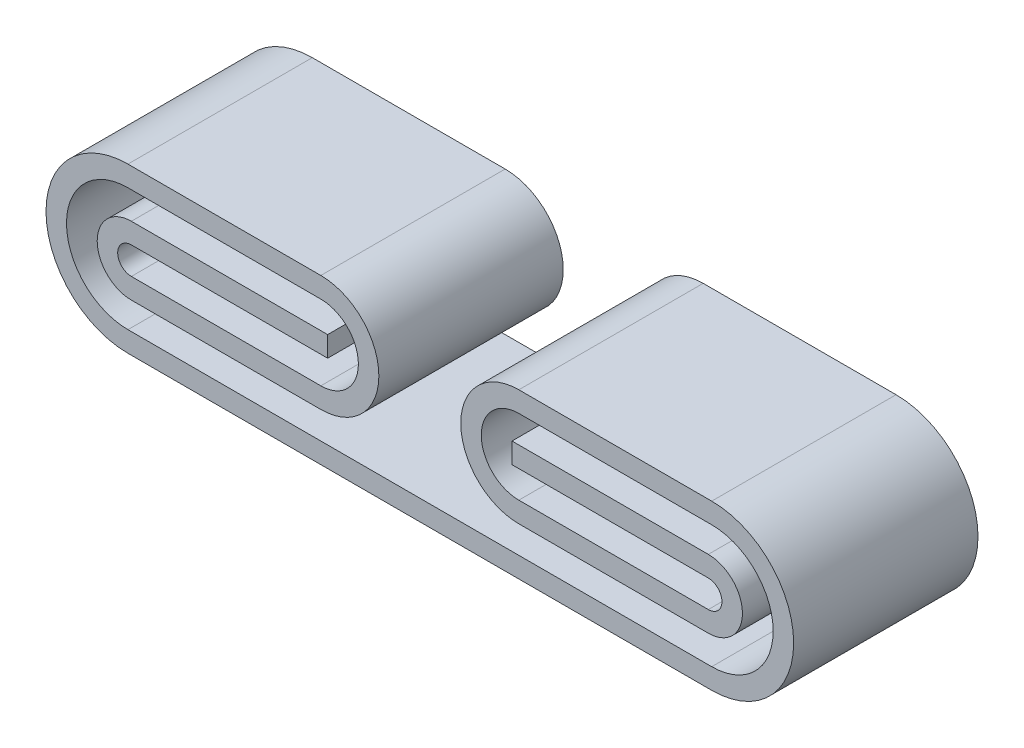
ISO-10303-21;
HEADER;
FILE_DESCRIPTION(('STEP AP214'),'2;1');
FILE_NAME('part.step','',(''),(''),'','','');
FILE_SCHEMA(('AUTOMOTIVE_DESIGN { 1 0 10303 214 1 1 1 1 }'));
ENDSEC;
DATA;
#1=APPLICATION_CONTEXT('core data for automotive mechanical design processes');
#2=APPLICATION_PROTOCOL_DEFINITION('international standard','automotive_design',2000,#1);
#3=PRODUCT_CONTEXT('',#1,'mechanical');
#4=PRODUCT('Part','Part','',(#3));
#5=PRODUCT_RELATED_PRODUCT_CATEGORY('part','',(#4));
#6=PRODUCT_DEFINITION_FORMATION('','',#4);
#7=PRODUCT_DEFINITION_CONTEXT('part definition',#1,'design');
#8=PRODUCT_DEFINITION('design','',#6,#7);
#9=PRODUCT_DEFINITION_SHAPE('','',#8);
#10=(LENGTH_UNIT() NAMED_UNIT(*) SI_UNIT(.MILLI.,.METRE.));
#11=(NAMED_UNIT(*) PLANE_ANGLE_UNIT() SI_UNIT($,.RADIAN.));
#12=(NAMED_UNIT(*) SI_UNIT($,.STERADIAN.) SOLID_ANGLE_UNIT());
#13=UNCERTAINTY_MEASURE_WITH_UNIT(LENGTH_MEASURE(1.E-05),#10,'distance_accuracy_value','');
#14=(GEOMETRIC_REPRESENTATION_CONTEXT(3) GLOBAL_UNCERTAINTY_ASSIGNED_CONTEXT((#13)) GLOBAL_UNIT_ASSIGNED_CONTEXT((#10,
#11,#12)) REPRESENTATION_CONTEXT('',''));
#15=CARTESIAN_POINT('',(0.,0.,0.));
#16=DIRECTION('',(0.,0.,1.));
#17=DIRECTION('',(1.,0.,0.));
#18=AXIS2_PLACEMENT_3D('',#15,#16,#17);
#19=CARTESIAN_POINT('',(0.,5.66666666666667,-5.));
#20=DIRECTION('',(0.,-1.,0.));
#21=DIRECTION('',(0.,0.,-1.));
#22=AXIS2_PLACEMENT_3D('',#19,#20,#21);
#23=PLANE('',#22);
#24=DIRECTION('',(0.,0.,1.));
#25=VECTOR('',#24,1.);
#26=CARTESIAN_POINT('',(-14.0833333333333,5.66666666666667,-5.));
#27=LINE('',#26,#25);
#28=CARTESIAN_POINT('',(-14.0833333333333,5.66666666666667,-5.));
#29=VERTEX_POINT('',#28);
#30=CARTESIAN_POINT('',(-14.0833333333333,5.66666666666667,4.));
#31=VERTEX_POINT('',#30);
#32=EDGE_CURVE('E38',#29,#31,#27,.T.);
#33=ORIENTED_EDGE('',*,*,#32,.T.);
#34=DIRECTION('',(1.,0.,0.));
#35=VECTOR('',#34,1.);
#36=CARTESIAN_POINT('',(0.,5.66666666666667,4.));
#37=LINE('',#36,#35);
#38=CARTESIAN_POINT('',(-4.5,5.66666666666667,4.));
#39=VERTEX_POINT('',#38);
#40=EDGE_CURVE('E307',#31,#39,#37,.T.);
#41=ORIENTED_EDGE('',*,*,#40,.T.);
#42=DIRECTION('',(0.,0.,1.));
#43=VECTOR('',#42,1.);
#44=CARTESIAN_POINT('',(-4.5,5.66666666666667,-5.));
#45=LINE('',#44,#43);
#46=CARTESIAN_POINT('',(-4.5,5.66666666666667,-5.));
#47=VERTEX_POINT('',#46);
#48=EDGE_CURVE('E11',#47,#39,#45,.T.);
#49=ORIENTED_EDGE('',*,*,#48,.F.);
#50=DIRECTION('',(1.,0.,0.));
#51=VECTOR('',#50,1.);
#52=CARTESIAN_POINT('',(0.,5.66666666666667,-5.));
#53=LINE('',#52,#51);
#54=EDGE_CURVE('E375',#29,#47,#53,.T.);
#55=ORIENTED_EDGE('',*,*,#54,.F.);
#56=EDGE_LOOP('',(#33,#41,#49,#55));
#57=FACE_BOUND('',#56,.T.);
#58=ADVANCED_FACE('F35',(#57),#23,.F.);
#59=CARTESIAN_POINT('',(-4.5,0.,-5.));
#60=DIRECTION('',(-1.,0.,0.));
#61=DIRECTION('',(0.,0.,1.));
#62=AXIS2_PLACEMENT_3D('',#59,#60,#61);
#63=PLANE('',#62);
#64=ORIENTED_EDGE('',*,*,#48,.T.);
#65=DIRECTION('',(0.,-1.,0.));
#66=VECTOR('',#65,1.);
#67=CARTESIAN_POINT('',(-4.5,0.,4.));
#68=LINE('',#67,#66);
#69=CARTESIAN_POINT('',(-4.5,4.66666666666667,4.));
#70=VERTEX_POINT('',#69);
#71=EDGE_CURVE('E372',#39,#70,#68,.T.);
#72=ORIENTED_EDGE('',*,*,#71,.T.);
#73=DIRECTION('',(0.,0.,1.));
#74=VECTOR('',#73,1.);
#75=CARTESIAN_POINT('',(-4.5,4.66666666666667,-5.));
#76=LINE('',#75,#74);
#77=CARTESIAN_POINT('',(-4.5,4.66666666666667,-5.));
#78=VERTEX_POINT('',#77);
#79=EDGE_CURVE('E43',#78,#70,#76,.T.);
#80=ORIENTED_EDGE('',*,*,#79,.F.);
#81=DIRECTION('',(0.,-1.,0.));
#82=VECTOR('',#81,1.);
#83=CARTESIAN_POINT('',(-4.5,0.,-5.));
#84=LINE('',#83,#82);
#85=EDGE_CURVE('E50',#47,#78,#84,.T.);
#86=ORIENTED_EDGE('',*,*,#85,.F.);
#87=EDGE_LOOP('',(#64,#72,#80,#86));
#88=FACE_BOUND('',#87,.T.);
#89=ADVANCED_FACE('F442',(#88),#63,.F.);
#90=CARTESIAN_POINT('',(0.,4.66666666666667,-5.));
#91=DIRECTION('',(0.,1.,0.));
#92=DIRECTION('',(0.,0.,1.));
#93=AXIS2_PLACEMENT_3D('',#90,#91,#92);
#94=PLANE('',#93);
#95=ORIENTED_EDGE('',*,*,#79,.T.);
#96=DIRECTION('',(-1.,0.,0.));
#97=VECTOR('',#96,1.);
#98=CARTESIAN_POINT('',(0.,4.66666666666667,4.));
#99=LINE('',#98,#97);
#100=CARTESIAN_POINT('',(-14.0833333333333,4.66666666666667,4.));
#101=VERTEX_POINT('',#100);
#102=EDGE_CURVE('E369',#70,#101,#99,.T.);
#103=ORIENTED_EDGE('',*,*,#102,.T.);
#104=DIRECTION('',(0.,0.,1.));
#105=VECTOR('',#104,1.);
#106=CARTESIAN_POINT('',(-14.0833333333333,4.66666666666667,-5.));
#107=LINE('',#106,#105);
#108=CARTESIAN_POINT('',(-14.0833333333333,4.66666666666667,-5.));
#109=VERTEX_POINT('',#108);
#110=EDGE_CURVE('E410',#109,#101,#107,.T.);
#111=ORIENTED_EDGE('',*,*,#110,.F.);
#112=DIRECTION('',(-1.,0.,0.));
#113=VECTOR('',#112,1.);
#114=CARTESIAN_POINT('',(0.,4.66666666666667,-5.));
#115=LINE('',#114,#113);
#116=EDGE_CURVE('E406',#78,#109,#115,.T.);
#117=ORIENTED_EDGE('',*,*,#116,.F.);
#118=EDGE_LOOP('',(#95,#103,#111,#117));
#119=FACE_BOUND('',#118,.T.);
#120=ADVANCED_FACE('F446',(#119),#94,.F.);
#121=CARTESIAN_POINT('',(-14.0833333333333,4.,-5.));
#122=DIRECTION('',(0.,0.,1.));
#123=DIRECTION('',(1.,0.,0.));
#124=AXIS2_PLACEMENT_3D('',#121,#122,#123);
#125=CYLINDRICAL_SURFACE('',#124,0.666666666666665);
#126=ORIENTED_EDGE('',*,*,#110,.T.);
#127=CARTESIAN_POINT('',(-14.0833333333333,4.,4.));
#128=DIRECTION('',(0.,0.,1.));
#129=DIRECTION('',(1.,0.,0.));
#130=AXIS2_PLACEMENT_3D('',#127,#128,#129);
#131=CIRCLE('',#130,0.666666666666665);
#132=CARTESIAN_POINT('',(-14.0833333333333,3.33333333333333,4.));
#133=VERTEX_POINT('',#132);
#134=EDGE_CURVE('E366',#101,#133,#131,.T.);
#135=ORIENTED_EDGE('',*,*,#134,.T.);
#136=DIRECTION('',(0.,0.,1.));
#137=VECTOR('',#136,1.);
#138=CARTESIAN_POINT('',(-14.0833333333333,3.33333333333333,-5.));
#139=LINE('',#138,#137);
#140=CARTESIAN_POINT('',(-14.0833333333333,3.33333333333333,-5.));
#141=VERTEX_POINT('',#140);
#142=EDGE_CURVE('E412',#141,#133,#139,.T.);
#143=ORIENTED_EDGE('',*,*,#142,.F.);
#144=CARTESIAN_POINT('',(-14.0833333333333,4.,-5.));
#145=DIRECTION('',(0.,0.,1.));
#146=DIRECTION('',(1.,0.,0.));
#147=AXIS2_PLACEMENT_3D('',#144,#145,#146);
#148=CIRCLE('',#147,0.666666666666665);
#149=EDGE_CURVE('E404',#109,#141,#148,.T.);
#150=ORIENTED_EDGE('',*,*,#149,.F.);
#151=EDGE_LOOP('',(#126,#135,#143,#150));
#152=FACE_BOUND('',#151,.T.);
#153=ADVANCED_FACE('F452',(#152),#125,.F.);
#154=CARTESIAN_POINT('',(0.,3.33333333333333,-5.));
#155=DIRECTION('',(0.,1.,0.));
#156=DIRECTION('',(-1.,0.,0.));
#157=AXIS2_PLACEMENT_3D('',#154,#155,#156);
#158=PLANE('',#157);
#159=ORIENTED_EDGE('',*,*,#142,.T.);
#160=DIRECTION('',(-1.,0.,0.));
#161=VECTOR('',#160,1.);
#162=CARTESIAN_POINT('',(0.,3.33333333333333,4.));
#163=LINE('',#162,#161);
#164=CARTESIAN_POINT('',(-4.83333333333334,3.33333333333333,4.));
#165=VERTEX_POINT('',#164);
#166=EDGE_CURVE('E363',#165,#133,#163,.T.);
#167=ORIENTED_EDGE('',*,*,#166,.F.);
#168=DIRECTION('',(0.,0.,1.));
#169=VECTOR('',#168,1.);
#170=CARTESIAN_POINT('',(-4.83333333333334,3.33333333333333,-5.));
#171=LINE('',#170,#169);
#172=CARTESIAN_POINT('',(-4.83333333333334,3.33333333333333,-5.));
#173=VERTEX_POINT('',#172);
#174=EDGE_CURVE('E414',#173,#165,#171,.T.);
#175=ORIENTED_EDGE('',*,*,#174,.F.);
#176=DIRECTION('',(-1.,0.,0.));
#177=VECTOR('',#176,1.);
#178=CARTESIAN_POINT('',(0.,3.33333333333333,-5.));
#179=LINE('',#178,#177);
#180=EDGE_CURVE('E401',#173,#141,#179,.T.);
#181=ORIENTED_EDGE('',*,*,#180,.T.);
#182=EDGE_LOOP('',(#159,#167,#175,#181));
#183=FACE_BOUND('',#182,.T.);
#184=ADVANCED_FACE('F455',(#183),#158,.T.);
#185=CARTESIAN_POINT('',(-4.83333333333334,5.16666666666667,-5.));
#186=DIRECTION('',(0.,0.,1.));
#187=DIRECTION('',(1.,0.,0.));
#188=AXIS2_PLACEMENT_3D('',#185,#186,#187);
#189=CYLINDRICAL_SURFACE('',#188,1.83333333333333);
#190=ORIENTED_EDGE('',*,*,#174,.T.);
#191=CARTESIAN_POINT('',(-4.83333333333334,5.16666666666667,4.));
#192=DIRECTION('',(0.,0.,1.));
#193=DIRECTION('',(1.,0.,0.));
#194=AXIS2_PLACEMENT_3D('',#191,#192,#193);
#195=CIRCLE('',#194,1.83333333333333);
#196=CARTESIAN_POINT('',(-4.83333333333334,7.,4.));
#197=VERTEX_POINT('',#196);
#198=EDGE_CURVE('E360',#165,#197,#195,.T.);
#199=ORIENTED_EDGE('',*,*,#198,.T.);
#200=DIRECTION('',(0.,0.,1.));
#201=VECTOR('',#200,1.);
#202=CARTESIAN_POINT('',(-4.83333333333334,7.,-5.));
#203=LINE('',#202,#201);
#204=CARTESIAN_POINT('',(-4.83333333333334,7.,-5.));
#205=VERTEX_POINT('',#204);
#206=EDGE_CURVE('E416',#205,#197,#203,.T.);
#207=ORIENTED_EDGE('',*,*,#206,.F.);
#208=CARTESIAN_POINT('',(-4.83333333333334,5.16666666666667,-5.));
#209=DIRECTION('',(0.,0.,1.));
#210=DIRECTION('',(1.,0.,0.));
#211=AXIS2_PLACEMENT_3D('',#208,#209,#210);
#212=CIRCLE('',#211,1.83333333333333);
#213=EDGE_CURVE('E399',#173,#205,#212,.T.);
#214=ORIENTED_EDGE('',*,*,#213,.F.);
#215=EDGE_LOOP('',(#190,#199,#207,#214));
#216=FACE_BOUND('',#215,.T.);
#217=ADVANCED_FACE('F460',(#216),#189,.F.);
#218=CARTESIAN_POINT('',(0.,7.,-5.));
#219=DIRECTION('',(0.,-1.,0.));
#220=DIRECTION('',(0.,0.,-1.));
#221=AXIS2_PLACEMENT_3D('',#218,#219,#220);
#222=PLANE('',#221);
#223=ORIENTED_EDGE('',*,*,#206,.T.);
#224=DIRECTION('',(1.,0.,0.));
#225=VECTOR('',#224,1.);
#226=CARTESIAN_POINT('',(0.,7.,4.));
#227=LINE('',#226,#225);
#228=CARTESIAN_POINT('',(-14.25,7.,4.));
#229=VERTEX_POINT('',#228);
#230=EDGE_CURVE('E357',#229,#197,#227,.T.);
#231=ORIENTED_EDGE('',*,*,#230,.F.);
#232=DIRECTION('',(0.,0.,1.));
#233=VECTOR('',#232,1.);
#234=CARTESIAN_POINT('',(-14.25,7.,-5.));
#235=LINE('',#234,#233);
#236=CARTESIAN_POINT('',(-14.25,7.,-5.));
#237=VERTEX_POINT('',#236);
#238=EDGE_CURVE('E418',#237,#229,#235,.T.);
#239=ORIENTED_EDGE('',*,*,#238,.F.);
#240=DIRECTION('',(1.,0.,0.));
#241=VECTOR('',#240,1.);
#242=CARTESIAN_POINT('',(0.,7.,-5.));
#243=LINE('',#242,#241);
#244=EDGE_CURVE('E396',#237,#205,#243,.T.);
#245=ORIENTED_EDGE('',*,*,#244,.T.);
#246=EDGE_LOOP('',(#223,#231,#239,#245));
#247=FACE_BOUND('',#246,.T.);
#248=ADVANCED_FACE('F465',(#247),#222,.T.);
#249=CARTESIAN_POINT('',(-14.25,4.,-5.));
#250=DIRECTION('',(0.,0.,1.));
#251=DIRECTION('',(1.,0.,0.));
#252=AXIS2_PLACEMENT_3D('',#249,#250,#251);
#253=CYLINDRICAL_SURFACE('',#252,3.);
#254=ORIENTED_EDGE('',*,*,#238,.T.);
#255=CARTESIAN_POINT('',(-14.25,4.,4.));
#256=DIRECTION('',(0.,0.,1.));
#257=DIRECTION('',(1.,0.,0.));
#258=AXIS2_PLACEMENT_3D('',#255,#256,#257);
#259=CIRCLE('',#258,3.);
#260=CARTESIAN_POINT('',(-14.25,1.,4.));
#261=VERTEX_POINT('',#260);
#262=EDGE_CURVE('E354',#229,#261,#259,.T.);
#263=ORIENTED_EDGE('',*,*,#262,.T.);
#264=DIRECTION('',(0.,0.,1.));
#265=VECTOR('',#264,1.);
#266=CARTESIAN_POINT('',(-14.25,1.,-5.));
#267=LINE('',#266,#265);
#268=CARTESIAN_POINT('',(-14.25,1.,-5.));
#269=VERTEX_POINT('',#268);
#270=EDGE_CURVE('E420',#269,#261,#267,.T.);
#271=ORIENTED_EDGE('',*,*,#270,.F.);
#272=CARTESIAN_POINT('',(-14.25,4.,-5.));
#273=DIRECTION('',(0.,0.,1.));
#274=DIRECTION('',(1.,0.,0.));
#275=AXIS2_PLACEMENT_3D('',#272,#273,#274);
#276=CIRCLE('',#275,3.);
#277=EDGE_CURVE('E394',#237,#269,#276,.T.);
#278=ORIENTED_EDGE('',*,*,#277,.F.);
#279=EDGE_LOOP('',(#254,#263,#271,#278));
#280=FACE_BOUND('',#279,.T.);
#281=ADVANCED_FACE('F469',(#280),#253,.F.);
#282=CARTESIAN_POINT('',(0.,1.,-5.));
#283=DIRECTION('',(0.,-1.,0.));
#284=DIRECTION('',(0.,0.,-1.));
#285=AXIS2_PLACEMENT_3D('',#282,#283,#284);
#286=PLANE('',#285);
#287=ORIENTED_EDGE('',*,*,#270,.T.);
#288=DIRECTION('',(1.,0.,0.));
#289=VECTOR('',#288,1.);
#290=CARTESIAN_POINT('',(0.,1.,4.));
#291=LINE('',#290,#289);
#292=CARTESIAN_POINT('',(14.25,1.,4.));
#293=VERTEX_POINT('',#292);
#294=EDGE_CURVE('E352',#261,#293,#291,.T.);
#295=ORIENTED_EDGE('',*,*,#294,.T.);
#296=DIRECTION('',(0.,0.,1.));
#297=VECTOR('',#296,1.);
#298=CARTESIAN_POINT('',(14.25,1.,-5.));
#299=LINE('',#298,#297);
#300=CARTESIAN_POINT('',(14.25,1.,-5.));
#301=VERTEX_POINT('',#300);
#302=EDGE_CURVE('E319',#301,#293,#299,.T.);
#303=ORIENTED_EDGE('',*,*,#302,.F.);
#304=DIRECTION('',(1.,0.,0.));
#305=VECTOR('',#304,1.);
#306=CARTESIAN_POINT('',(0.,1.,-5.));
#307=LINE('',#306,#305);
#308=EDGE_CURVE('E392',#269,#301,#307,.T.);
#309=ORIENTED_EDGE('',*,*,#308,.F.);
#310=EDGE_LOOP('',(#287,#295,#303,#309));
#311=FACE_BOUND('',#310,.T.);
#312=ADVANCED_FACE('F474',(#311),#286,.F.);
#313=CARTESIAN_POINT('',(0.,0.,-5.));
#314=DIRECTION('',(0.,-1.,0.));
#315=DIRECTION('',(0.,0.,-1.));
#316=AXIS2_PLACEMENT_3D('',#313,#314,#315);
#317=PLANE('',#316);
#318=DIRECTION('',(1.,0.,0.));
#319=VECTOR('',#318,1.);
#320=CARTESIAN_POINT('',(0.,0.,-5.));
#321=LINE('',#320,#319);
#322=CARTESIAN_POINT('',(-14.25,0.,-5.));
#323=VERTEX_POINT('',#322);
#324=CARTESIAN_POINT('',(14.25,0.,-5.));
#325=VERTEX_POINT('',#324);
#326=EDGE_CURVE('E390',#323,#325,#321,.T.);
#327=ORIENTED_EDGE('',*,*,#326,.T.);
#328=DIRECTION('',(0.,0.,1.));
#329=VECTOR('',#328,1.);
#330=CARTESIAN_POINT('',(14.25,0.,-5.));
#331=LINE('',#330,#329);
#332=CARTESIAN_POINT('',(14.25,0.,4.));
#333=VERTEX_POINT('',#332);
#334=EDGE_CURVE('E316',#325,#333,#331,.T.);
#335=ORIENTED_EDGE('',*,*,#334,.T.);
#336=DIRECTION('',(1.,0.,0.));
#337=VECTOR('',#336,1.);
#338=CARTESIAN_POINT('',(0.,0.,4.));
#339=LINE('',#338,#337);
#340=CARTESIAN_POINT('',(-14.25,0.,4.));
#341=VERTEX_POINT('',#340);
#342=EDGE_CURVE('E350',#341,#333,#339,.T.);
#343=ORIENTED_EDGE('',*,*,#342,.F.);
#344=DIRECTION('',(0.,0.,1.));
#345=VECTOR('',#344,1.);
#346=CARTESIAN_POINT('',(-14.25,0.,-5.));
#347=LINE('',#346,#345);
#348=EDGE_CURVE('E422',#323,#341,#347,.T.);
#349=ORIENTED_EDGE('',*,*,#348,.F.);
#350=EDGE_LOOP('',(#327,#335,#343,#349));
#351=FACE_BOUND('',#350,.T.);
#352=ADVANCED_FACE('F525',(#351),#317,.T.);
#353=CARTESIAN_POINT('',(-14.25,4.,-5.));
#354=DIRECTION('',(0.,0.,1.));
#355=DIRECTION('',(1.,0.,0.));
#356=AXIS2_PLACEMENT_3D('',#353,#354,#355);
#357=CYLINDRICAL_SURFACE('',#356,4.);
#358=ORIENTED_EDGE('',*,*,#348,.T.);
#359=CARTESIAN_POINT('',(-14.25,4.,4.));
#360=DIRECTION('',(0.,0.,1.));
#361=DIRECTION('',(1.,0.,0.));
#362=AXIS2_PLACEMENT_3D('',#359,#360,#361);
#363=CIRCLE('',#362,4.);
#364=CARTESIAN_POINT('',(-14.25,8.,4.));
#365=VERTEX_POINT('',#364);
#366=EDGE_CURVE('E347',#365,#341,#363,.T.);
#367=ORIENTED_EDGE('',*,*,#366,.F.);
#368=DIRECTION('',(0.,0.,1.));
#369=VECTOR('',#368,1.);
#370=CARTESIAN_POINT('',(-14.25,8.,-5.));
#371=LINE('',#370,#369);
#372=CARTESIAN_POINT('',(-14.25,8.,-5.));
#373=VERTEX_POINT('',#372);
#374=EDGE_CURVE('E424',#373,#365,#371,.T.);
#375=ORIENTED_EDGE('',*,*,#374,.F.);
#376=CARTESIAN_POINT('',(-14.25,4.,-5.));
#377=DIRECTION('',(0.,0.,1.));
#378=DIRECTION('',(1.,0.,0.));
#379=AXIS2_PLACEMENT_3D('',#376,#377,#378);
#380=CIRCLE('',#379,4.);
#381=EDGE_CURVE('E387',#373,#323,#380,.T.);
#382=ORIENTED_EDGE('',*,*,#381,.T.);
#383=EDGE_LOOP('',(#358,#367,#375,#382));
#384=FACE_BOUND('',#383,.T.);
#385=ADVANCED_FACE('F528',(#384),#357,.T.);
#386=CARTESIAN_POINT('',(0.,8.,-5.));
#387=DIRECTION('',(0.,-1.,0.));
#388=DIRECTION('',(0.,0.,-1.));
#389=AXIS2_PLACEMENT_3D('',#386,#387,#388);
#390=PLANE('',#389);
#391=ORIENTED_EDGE('',*,*,#374,.T.);
#392=DIRECTION('',(1.,0.,0.));
#393=VECTOR('',#392,1.);
#394=CARTESIAN_POINT('',(0.,8.,4.));
#395=LINE('',#394,#393);
#396=CARTESIAN_POINT('',(-4.83333333333334,8.,4.));
#397=VERTEX_POINT('',#396);
#398=EDGE_CURVE('E344',#365,#397,#395,.T.);
#399=ORIENTED_EDGE('',*,*,#398,.T.);
#400=DIRECTION('',(0.,0.,1.));
#401=VECTOR('',#400,1.);
#402=CARTESIAN_POINT('',(-4.83333333333334,8.,-5.));
#403=LINE('',#402,#401);
#404=CARTESIAN_POINT('',(-4.83333333333334,8.,-5.));
#405=VERTEX_POINT('',#404);
#406=EDGE_CURVE('E426',#405,#397,#403,.T.);
#407=ORIENTED_EDGE('',*,*,#406,.F.);
#408=DIRECTION('',(1.,0.,0.));
#409=VECTOR('',#408,1.);
#410=CARTESIAN_POINT('',(0.,8.,-5.));
#411=LINE('',#410,#409);
#412=EDGE_CURVE('E385',#373,#405,#411,.T.);
#413=ORIENTED_EDGE('',*,*,#412,.F.);
#414=EDGE_LOOP('',(#391,#399,#407,#413));
#415=FACE_BOUND('',#414,.T.);
#416=ADVANCED_FACE('F534',(#415),#390,.F.);
#417=CARTESIAN_POINT('',(-4.83333333333334,5.16666666666667,-5.));
#418=DIRECTION('',(0.,0.,1.));
#419=DIRECTION('',(1.,0.,0.));
#420=AXIS2_PLACEMENT_3D('',#417,#418,#419);
#421=CYLINDRICAL_SURFACE('',#420,2.83333333333333);
#422=ORIENTED_EDGE('',*,*,#406,.T.);
#423=CARTESIAN_POINT('',(-4.83333333333334,5.16666666666667,4.));
#424=DIRECTION('',(0.,0.,1.));
#425=DIRECTION('',(1.,0.,0.));
#426=AXIS2_PLACEMENT_3D('',#423,#424,#425);
#427=CIRCLE('',#426,2.83333333333333);
#428=CARTESIAN_POINT('',(-4.83333333333334,2.33333333333333,4.));
#429=VERTEX_POINT('',#428);
#430=EDGE_CURVE('E341',#429,#397,#427,.T.);
#431=ORIENTED_EDGE('',*,*,#430,.F.);
#432=DIRECTION('',(0.,0.,1.));
#433=VECTOR('',#432,1.);
#434=CARTESIAN_POINT('',(-4.83333333333334,2.33333333333333,-5.));
#435=LINE('',#434,#433);
#436=CARTESIAN_POINT('',(-4.83333333333334,2.33333333333333,-5.));
#437=VERTEX_POINT('',#436);
#438=EDGE_CURVE('E428',#437,#429,#435,.T.);
#439=ORIENTED_EDGE('',*,*,#438,.F.);
#440=CARTESIAN_POINT('',(-4.83333333333334,5.16666666666667,-5.));
#441=DIRECTION('',(0.,0.,1.));
#442=DIRECTION('',(1.,0.,0.));
#443=AXIS2_PLACEMENT_3D('',#440,#441,#442);
#444=CIRCLE('',#443,2.83333333333333);
#445=EDGE_CURVE('E382',#437,#405,#444,.T.);
#446=ORIENTED_EDGE('',*,*,#445,.T.);
#447=EDGE_LOOP('',(#422,#431,#439,#446));
#448=FACE_BOUND('',#447,.T.);
#449=ADVANCED_FACE('F538',(#448),#421,.T.);
#450=CARTESIAN_POINT('',(0.,2.33333333333333,-5.));
#451=DIRECTION('',(0.,1.,0.));
#452=DIRECTION('',(0.,0.,1.));
#453=AXIS2_PLACEMENT_3D('',#450,#451,#452);
#454=PLANE('',#453);
#455=ORIENTED_EDGE('',*,*,#438,.T.);
#456=DIRECTION('',(-1.,0.,0.));
#457=VECTOR('',#456,1.);
#458=CARTESIAN_POINT('',(0.,2.33333333333333,4.));
#459=LINE('',#458,#457);
#460=CARTESIAN_POINT('',(-14.0833333333333,2.33333333333333,4.));
#461=VERTEX_POINT('',#460);
#462=EDGE_CURVE('E338',#429,#461,#459,.T.);
#463=ORIENTED_EDGE('',*,*,#462,.T.);
#464=DIRECTION('',(0.,0.,1.));
#465=VECTOR('',#464,1.);
#466=CARTESIAN_POINT('',(-14.0833333333333,2.33333333333333,-5.));
#467=LINE('',#466,#465);
#468=CARTESIAN_POINT('',(-14.0833333333333,2.33333333333333,-5.));
#469=VERTEX_POINT('',#468);
#470=EDGE_CURVE('E429',#469,#461,#467,.T.);
#471=ORIENTED_EDGE('',*,*,#470,.F.);
#472=DIRECTION('',(-1.,0.,0.));
#473=VECTOR('',#472,1.);
#474=CARTESIAN_POINT('',(0.,2.33333333333333,-5.));
#475=LINE('',#474,#473);
#476=EDGE_CURVE('E380',#437,#469,#475,.T.);
#477=ORIENTED_EDGE('',*,*,#476,.F.);
#478=EDGE_LOOP('',(#455,#463,#471,#477));
#479=FACE_BOUND('',#478,.T.);
#480=ADVANCED_FACE('F541',(#479),#454,.F.);
#481=CARTESIAN_POINT('',(-14.0833333333333,4.,-5.));
#482=DIRECTION('',(0.,0.,1.));
#483=DIRECTION('',(1.,0.,0.));
#484=AXIS2_PLACEMENT_3D('',#481,#482,#483);
#485=CYLINDRICAL_SURFACE('',#484,1.66666666666667);
#486=ORIENTED_EDGE('',*,*,#470,.T.);
#487=CARTESIAN_POINT('',(-14.0833333333333,4.,4.));
#488=DIRECTION('',(0.,0.,1.));
#489=DIRECTION('',(1.,0.,0.));
#490=AXIS2_PLACEMENT_3D('',#487,#488,#489);
#491=CIRCLE('',#490,1.66666666666667);
#492=EDGE_CURVE('E335',#31,#461,#491,.T.);
#493=ORIENTED_EDGE('',*,*,#492,.F.);
#494=ORIENTED_EDGE('',*,*,#32,.F.);
#495=CARTESIAN_POINT('',(-14.0833333333333,4.,-5.));
#496=DIRECTION('',(0.,0.,1.));
#497=DIRECTION('',(1.,0.,0.));
#498=AXIS2_PLACEMENT_3D('',#495,#496,#497);
#499=CIRCLE('',#498,1.66666666666667);
#500=EDGE_CURVE('E377',#29,#469,#499,.T.);
#501=ORIENTED_EDGE('',*,*,#500,.T.);
#502=EDGE_LOOP('',(#486,#493,#494,#501));
#503=FACE_BOUND('',#502,.T.);
#504=ADVANCED_FACE('F438',(#503),#485,.T.);
#505=CARTESIAN_POINT('',(0.,0.,-5.));
#506=DIRECTION('',(0.,0.,1.));
#507=DIRECTION('',(1.,0.,0.));
#508=AXIS2_PLACEMENT_3D('',#505,#506,#507);
#509=PLANE('',#508);
#510=ORIENTED_EDGE('',*,*,#54,.T.);
#511=ORIENTED_EDGE('',*,*,#85,.T.);
#512=ORIENTED_EDGE('',*,*,#116,.T.);
#513=ORIENTED_EDGE('',*,*,#149,.T.);
#514=ORIENTED_EDGE('',*,*,#180,.F.);
#515=ORIENTED_EDGE('',*,*,#213,.T.);
#516=ORIENTED_EDGE('',*,*,#244,.F.);
#517=ORIENTED_EDGE('',*,*,#277,.T.);
#518=ORIENTED_EDGE('',*,*,#308,.T.);
#519=CARTESIAN_POINT('',(14.25,4.,-5.));
#520=DIRECTION('',(0.,0.,-1.));
#521=DIRECTION('',(-1.,0.,0.));
#522=AXIS2_PLACEMENT_3D('',#519,#520,#521);
#523=CIRCLE('',#522,3.);
#524=CARTESIAN_POINT('',(14.25,7.,-5.));
#525=VERTEX_POINT('',#524);
#526=EDGE_CURVE('E290',#525,#301,#523,.T.);
#527=ORIENTED_EDGE('',*,*,#526,.F.);
#528=DIRECTION('',(-1.,0.,0.));
#529=VECTOR('',#528,1.);
#530=CARTESIAN_POINT('',(0.,7.,-5.));
#531=LINE('',#530,#529);
#532=CARTESIAN_POINT('',(4.83333333333334,7.,-5.));
#533=VERTEX_POINT('',#532);
#534=EDGE_CURVE('E288',#525,#533,#531,.T.);
#535=ORIENTED_EDGE('',*,*,#534,.T.);
#536=CARTESIAN_POINT('',(4.83333333333334,5.16666666666667,-5.));
#537=DIRECTION('',(0.,0.,-1.));
#538=DIRECTION('',(-1.,0.,0.));
#539=AXIS2_PLACEMENT_3D('',#536,#537,#538);
#540=CIRCLE('',#539,1.83333333333333);
#541=CARTESIAN_POINT('',(4.83333333333334,3.33333333333333,-5.));
#542=VERTEX_POINT('',#541);
#543=EDGE_CURVE('E285',#542,#533,#540,.T.);
#544=ORIENTED_EDGE('',*,*,#543,.F.);
#545=DIRECTION('',(1.,0.,0.));
#546=VECTOR('',#545,1.);
#547=CARTESIAN_POINT('',(0.,3.33333333333333,-5.));
#548=LINE('',#547,#546);
#549=CARTESIAN_POINT('',(14.0833333333333,3.33333333333333,-5.));
#550=VERTEX_POINT('',#549);
#551=EDGE_CURVE('E283',#542,#550,#548,.T.);
#552=ORIENTED_EDGE('',*,*,#551,.T.);
#553=CARTESIAN_POINT('',(14.0833333333333,4.,-5.));
#554=DIRECTION('',(0.,0.,-1.));
#555=DIRECTION('',(-1.,0.,0.));
#556=AXIS2_PLACEMENT_3D('',#553,#554,#555);
#557=CIRCLE('',#556,0.666666666666665);
#558=CARTESIAN_POINT('',(14.0833333333333,4.66666666666667,-5.));
#559=VERTEX_POINT('',#558);
#560=EDGE_CURVE('E280',#559,#550,#557,.T.);
#561=ORIENTED_EDGE('',*,*,#560,.F.);
#562=DIRECTION('',(1.,0.,0.));
#563=VECTOR('',#562,1.);
#564=CARTESIAN_POINT('',(0.,4.66666666666667,-5.));
#565=LINE('',#564,#563);
#566=CARTESIAN_POINT('',(4.5,4.66666666666667,-5.));
#567=VERTEX_POINT('',#566);
#568=EDGE_CURVE('E277',#567,#559,#565,.T.);
#569=ORIENTED_EDGE('',*,*,#568,.F.);
#570=DIRECTION('',(0.,-1.,0.));
#571=VECTOR('',#570,1.);
#572=CARTESIAN_POINT('',(4.5,0.,-5.));
#573=LINE('',#572,#571);
#574=CARTESIAN_POINT('',(4.5,5.66666666666667,-5.));
#575=VERTEX_POINT('',#574);
#576=EDGE_CURVE('E275',#575,#567,#573,.T.);
#577=ORIENTED_EDGE('',*,*,#576,.F.);
#578=DIRECTION('',(-1.,0.,0.));
#579=VECTOR('',#578,1.);
#580=CARTESIAN_POINT('',(0.,5.66666666666667,-5.));
#581=LINE('',#580,#579);
#582=CARTESIAN_POINT('',(14.0833333333333,5.66666666666667,-5.));
#583=VERTEX_POINT('',#582);
#584=EDGE_CURVE('E224',#583,#575,#581,.T.);
#585=ORIENTED_EDGE('',*,*,#584,.F.);
#586=CARTESIAN_POINT('',(14.0833333333333,4.,-5.));
#587=DIRECTION('',(0.,0.,-1.));
#588=DIRECTION('',(-1.,0.,0.));
#589=AXIS2_PLACEMENT_3D('',#586,#587,#588);
#590=CIRCLE('',#589,1.66666666666667);
#591=CARTESIAN_POINT('',(14.0833333333333,2.33333333333333,-5.));
#592=VERTEX_POINT('',#591);
#593=EDGE_CURVE('E229',#583,#592,#590,.T.);
#594=ORIENTED_EDGE('',*,*,#593,.T.);
#595=DIRECTION('',(1.,0.,0.));
#596=VECTOR('',#595,1.);
#597=CARTESIAN_POINT('',(0.,2.33333333333333,-5.));
#598=LINE('',#597,#596);
#599=CARTESIAN_POINT('',(4.83333333333334,2.33333333333333,-5.));
#600=VERTEX_POINT('',#599);
#601=EDGE_CURVE('E301',#600,#592,#598,.T.);
#602=ORIENTED_EDGE('',*,*,#601,.F.);
#603=CARTESIAN_POINT('',(4.83333333333334,5.16666666666667,-5.));
#604=DIRECTION('',(0.,0.,-1.));
#605=DIRECTION('',(-1.,0.,0.));
#606=AXIS2_PLACEMENT_3D('',#603,#604,#605);
#607=CIRCLE('',#606,2.83333333333333);
#608=CARTESIAN_POINT('',(4.83333333333334,8.,-5.));
#609=VERTEX_POINT('',#608);
#610=EDGE_CURVE('E299',#600,#609,#607,.T.);
#611=ORIENTED_EDGE('',*,*,#610,.T.);
#612=DIRECTION('',(-1.,0.,0.));
#613=VECTOR('',#612,1.);
#614=CARTESIAN_POINT('',(0.,8.,-5.));
#615=LINE('',#614,#613);
#616=CARTESIAN_POINT('',(14.25,8.,-5.));
#617=VERTEX_POINT('',#616);
#618=EDGE_CURVE('E296',#617,#609,#615,.T.);
#619=ORIENTED_EDGE('',*,*,#618,.F.);
#620=CARTESIAN_POINT('',(14.25,4.,-5.));
#621=DIRECTION('',(0.,0.,-1.));
#622=DIRECTION('',(-1.,0.,0.));
#623=AXIS2_PLACEMENT_3D('',#620,#621,#622);
#624=CIRCLE('',#623,4.);
#625=EDGE_CURVE('E293',#617,#325,#624,.T.);
#626=ORIENTED_EDGE('',*,*,#625,.T.);
#627=ORIENTED_EDGE('',*,*,#326,.F.);
#628=ORIENTED_EDGE('',*,*,#381,.F.);
#629=ORIENTED_EDGE('',*,*,#412,.T.);
#630=ORIENTED_EDGE('',*,*,#445,.F.);
#631=ORIENTED_EDGE('',*,*,#476,.T.);
#632=ORIENTED_EDGE('',*,*,#500,.F.);
#633=EDGE_LOOP('',(#510,#511,#512,#513,#514,#515,#516,#517,#518,#527,#535,#544,#552,#561,#569,
#577,#585,#594,#602,#611,#619,#626,#627,#628,#629,#630,#631,#632));
#634=FACE_BOUND('',#633,.T.);
#635=ADVANCED_FACE('F448',(#634),#509,.F.);
#636=CARTESIAN_POINT('',(0.,0.,4.));
#637=DIRECTION('',(0.,0.,1.));
#638=DIRECTION('',(1.,0.,0.));
#639=AXIS2_PLACEMENT_3D('',#636,#637,#638);
#640=PLANE('',#639);
#641=ORIENTED_EDGE('',*,*,#40,.F.);
#642=ORIENTED_EDGE('',*,*,#492,.T.);
#643=ORIENTED_EDGE('',*,*,#462,.F.);
#644=ORIENTED_EDGE('',*,*,#430,.T.);
#645=ORIENTED_EDGE('',*,*,#398,.F.);
#646=ORIENTED_EDGE('',*,*,#366,.T.);
#647=ORIENTED_EDGE('',*,*,#342,.T.);
#648=CARTESIAN_POINT('',(14.25,4.,4.));
#649=DIRECTION('',(0.,0.,-1.));
#650=DIRECTION('',(-1.,0.,0.));
#651=AXIS2_PLACEMENT_3D('',#648,#649,#650);
#652=CIRCLE('',#651,4.);
#653=CARTESIAN_POINT('',(14.25,8.,4.));
#654=VERTEX_POINT('',#653);
#655=EDGE_CURVE('E262',#654,#333,#652,.T.);
#656=ORIENTED_EDGE('',*,*,#655,.F.);
#657=DIRECTION('',(-1.,0.,0.));
#658=VECTOR('',#657,1.);
#659=CARTESIAN_POINT('',(0.,8.,4.));
#660=LINE('',#659,#658);
#661=CARTESIAN_POINT('',(4.83333333333334,8.,4.));
#662=VERTEX_POINT('',#661);
#663=EDGE_CURVE('E265',#654,#662,#660,.T.);
#664=ORIENTED_EDGE('',*,*,#663,.T.);
#665=CARTESIAN_POINT('',(4.83333333333334,5.16666666666667,4.));
#666=DIRECTION('',(0.,0.,-1.));
#667=DIRECTION('',(-1.,0.,0.));
#668=AXIS2_PLACEMENT_3D('',#665,#666,#667);
#669=CIRCLE('',#668,2.83333333333333);
#670=CARTESIAN_POINT('',(4.83333333333334,2.33333333333333,4.));
#671=VERTEX_POINT('',#670);
#672=EDGE_CURVE('E268',#671,#662,#669,.T.);
#673=ORIENTED_EDGE('',*,*,#672,.F.);
#674=DIRECTION('',(1.,0.,0.));
#675=VECTOR('',#674,1.);
#676=CARTESIAN_POINT('',(0.,2.33333333333333,4.));
#677=LINE('',#676,#675);
#678=CARTESIAN_POINT('',(14.0833333333333,2.33333333333333,4.));
#679=VERTEX_POINT('',#678);
#680=EDGE_CURVE('E271',#671,#679,#677,.T.);
#681=ORIENTED_EDGE('',*,*,#680,.T.);
#682=CARTESIAN_POINT('',(14.0833333333333,4.,4.));
#683=DIRECTION('',(0.,0.,-1.));
#684=DIRECTION('',(-1.,0.,0.));
#685=AXIS2_PLACEMENT_3D('',#682,#683,#684);
#686=CIRCLE('',#685,1.66666666666667);
#687=CARTESIAN_POINT('',(14.0833333333333,5.66666666666667,4.));
#688=VERTEX_POINT('',#687);
#689=EDGE_CURVE('E243',#688,#679,#686,.T.);
#690=ORIENTED_EDGE('',*,*,#689,.F.);
#691=DIRECTION('',(-1.,0.,0.));
#692=VECTOR('',#691,1.);
#693=CARTESIAN_POINT('',(0.,5.66666666666667,4.));
#694=LINE('',#693,#692);
#695=CARTESIAN_POINT('',(4.5,5.66666666666667,4.));
#696=VERTEX_POINT('',#695);
#697=EDGE_CURVE('E221',#688,#696,#694,.T.);
#698=ORIENTED_EDGE('',*,*,#697,.T.);
#699=DIRECTION('',(0.,-1.,0.));
#700=VECTOR('',#699,1.);
#701=CARTESIAN_POINT('',(4.5,0.,4.));
#702=LINE('',#701,#700);
#703=CARTESIAN_POINT('',(4.5,4.66666666666667,4.));
#704=VERTEX_POINT('',#703);
#705=EDGE_CURVE('E232',#696,#704,#702,.T.);
#706=ORIENTED_EDGE('',*,*,#705,.T.);
#707=DIRECTION('',(1.,0.,0.));
#708=VECTOR('',#707,1.);
#709=CARTESIAN_POINT('',(0.,4.66666666666667,4.));
#710=LINE('',#709,#708);
#711=CARTESIAN_POINT('',(14.0833333333333,4.66666666666667,4.));
#712=VERTEX_POINT('',#711);
#713=EDGE_CURVE('E237',#704,#712,#710,.T.);
#714=ORIENTED_EDGE('',*,*,#713,.T.);
#715=CARTESIAN_POINT('',(14.0833333333333,4.,4.));
#716=DIRECTION('',(0.,0.,-1.));
#717=DIRECTION('',(-1.,0.,0.));
#718=AXIS2_PLACEMENT_3D('',#715,#716,#717);
#719=CIRCLE('',#718,0.666666666666665);
#720=CARTESIAN_POINT('',(14.0833333333333,3.33333333333333,4.));
#721=VERTEX_POINT('',#720);
#722=EDGE_CURVE('E247',#712,#721,#719,.T.);
#723=ORIENTED_EDGE('',*,*,#722,.T.);
#724=DIRECTION('',(1.,0.,0.));
#725=VECTOR('',#724,1.);
#726=CARTESIAN_POINT('',(0.,3.33333333333333,4.));
#727=LINE('',#726,#725);
#728=CARTESIAN_POINT('',(4.83333333333334,3.33333333333333,4.));
#729=VERTEX_POINT('',#728);
#730=EDGE_CURVE('E250',#729,#721,#727,.T.);
#731=ORIENTED_EDGE('',*,*,#730,.F.);
#732=CARTESIAN_POINT('',(4.83333333333334,5.16666666666667,4.));
#733=DIRECTION('',(0.,0.,-1.));
#734=DIRECTION('',(-1.,0.,0.));
#735=AXIS2_PLACEMENT_3D('',#732,#733,#734);
#736=CIRCLE('',#735,1.83333333333333);
#737=CARTESIAN_POINT('',(4.83333333333334,7.,4.));
#738=VERTEX_POINT('',#737);
#739=EDGE_CURVE('E253',#729,#738,#736,.T.);
#740=ORIENTED_EDGE('',*,*,#739,.T.);
#741=DIRECTION('',(-1.,0.,0.));
#742=VECTOR('',#741,1.);
#743=CARTESIAN_POINT('',(0.,7.,4.));
#744=LINE('',#743,#742);
#745=CARTESIAN_POINT('',(14.25,7.,4.));
#746=VERTEX_POINT('',#745);
#747=EDGE_CURVE('E256',#746,#738,#744,.T.);
#748=ORIENTED_EDGE('',*,*,#747,.F.);
#749=CARTESIAN_POINT('',(14.25,4.,4.));
#750=DIRECTION('',(0.,0.,-1.));
#751=DIRECTION('',(-1.,0.,0.));
#752=AXIS2_PLACEMENT_3D('',#749,#750,#751);
#753=CIRCLE('',#752,3.);
#754=EDGE_CURVE('E259',#746,#293,#753,.T.);
#755=ORIENTED_EDGE('',*,*,#754,.T.);
#756=ORIENTED_EDGE('',*,*,#294,.F.);
#757=ORIENTED_EDGE('',*,*,#262,.F.);
#758=ORIENTED_EDGE('',*,*,#230,.T.);
#759=ORIENTED_EDGE('',*,*,#198,.F.);
#760=ORIENTED_EDGE('',*,*,#166,.T.);
#761=ORIENTED_EDGE('',*,*,#134,.F.);
#762=ORIENTED_EDGE('',*,*,#102,.F.);
#763=ORIENTED_EDGE('',*,*,#71,.F.);
#764=EDGE_LOOP('',(#641,#642,#643,#644,#645,#646,#647,#656,#664,#673,#681,#690,#698,#706,#714,
#723,#731,#740,#748,#755,#756,#757,#758,#759,#760,#761,#762,#763));
#765=FACE_BOUND('',#764,.T.);
#766=ADVANCED_FACE('F240',(#765),#640,.T.);
#767=CARTESIAN_POINT('',(0.,5.66666666666667,-5.));
#768=DIRECTION('',(0.,1.,0.));
#769=DIRECTION('',(0.,0.,1.));
#770=AXIS2_PLACEMENT_3D('',#767,#768,#769);
#771=PLANE('',#770);
#772=DIRECTION('',(0.,0.,1.));
#773=VECTOR('',#772,1.);
#774=CARTESIAN_POINT('',(4.5,5.66666666666667,-5.));
#775=LINE('',#774,#773);
#776=EDGE_CURVE('E217',#575,#696,#775,.T.);
#777=ORIENTED_EDGE('',*,*,#776,.T.);
#778=ORIENTED_EDGE('',*,*,#697,.F.);
#779=DIRECTION('',(0.,0.,1.));
#780=VECTOR('',#779,1.);
#781=CARTESIAN_POINT('',(14.0833333333333,5.66666666666667,-5.));
#782=LINE('',#781,#780);
#783=EDGE_CURVE('E305',#583,#688,#782,.T.);
#784=ORIENTED_EDGE('',*,*,#783,.F.);
#785=ORIENTED_EDGE('',*,*,#584,.T.);
#786=EDGE_LOOP('',(#777,#778,#784,#785));
#787=FACE_BOUND('',#786,.T.);
#788=ADVANCED_FACE('F219',(#787),#771,.T.);
#789=CARTESIAN_POINT('',(14.0833333333333,4.,-5.));
#790=DIRECTION('',(0.,0.,1.));
#791=DIRECTION('',(1.,0.,0.));
#792=AXIS2_PLACEMENT_3D('',#789,#790,#791);
#793=CYLINDRICAL_SURFACE('',#792,1.66666666666667);
#794=ORIENTED_EDGE('',*,*,#783,.T.);
#795=ORIENTED_EDGE('',*,*,#689,.T.);
#796=DIRECTION('',(0.,0.,1.));
#797=VECTOR('',#796,1.);
#798=CARTESIAN_POINT('',(14.0833333333333,2.33333333333333,-5.));
#799=LINE('',#798,#797);
#800=EDGE_CURVE('E308',#592,#679,#799,.T.);
#801=ORIENTED_EDGE('',*,*,#800,.F.);
#802=ORIENTED_EDGE('',*,*,#593,.F.);
#803=EDGE_LOOP('',(#794,#795,#801,#802));
#804=FACE_BOUND('',#803,.T.);
#805=ADVANCED_FACE('F504',(#804),#793,.T.);
#806=CARTESIAN_POINT('',(0.,2.33333333333333,-5.));
#807=DIRECTION('',(0.,-1.,0.));
#808=DIRECTION('',(0.,0.,-1.));
#809=AXIS2_PLACEMENT_3D('',#806,#807,#808);
#810=PLANE('',#809);
#811=ORIENTED_EDGE('',*,*,#800,.T.);
#812=ORIENTED_EDGE('',*,*,#680,.F.);
#813=DIRECTION('',(0.,0.,1.));
#814=VECTOR('',#813,1.);
#815=CARTESIAN_POINT('',(4.83333333333334,2.33333333333333,-5.));
#816=LINE('',#815,#814);
#817=EDGE_CURVE('E310',#600,#671,#816,.T.);
#818=ORIENTED_EDGE('',*,*,#817,.F.);
#819=ORIENTED_EDGE('',*,*,#601,.T.);
#820=EDGE_LOOP('',(#811,#812,#818,#819));
#821=FACE_BOUND('',#820,.T.);
#822=ADVANCED_FACE('F507',(#821),#810,.T.);
#823=CARTESIAN_POINT('',(4.83333333333334,5.16666666666667,-5.));
#824=DIRECTION('',(0.,0.,1.));
#825=DIRECTION('',(1.,0.,0.));
#826=AXIS2_PLACEMENT_3D('',#823,#824,#825);
#827=CYLINDRICAL_SURFACE('',#826,2.83333333333333);
#828=ORIENTED_EDGE('',*,*,#817,.T.);
#829=ORIENTED_EDGE('',*,*,#672,.T.);
#830=DIRECTION('',(0.,0.,1.));
#831=VECTOR('',#830,1.);
#832=CARTESIAN_POINT('',(4.83333333333334,8.,-5.));
#833=LINE('',#832,#831);
#834=EDGE_CURVE('E312',#609,#662,#833,.T.);
#835=ORIENTED_EDGE('',*,*,#834,.F.);
#836=ORIENTED_EDGE('',*,*,#610,.F.);
#837=EDGE_LOOP('',(#828,#829,#835,#836));
#838=FACE_BOUND('',#837,.T.);
#839=ADVANCED_FACE('F512',(#838),#827,.T.);
#840=CARTESIAN_POINT('',(0.,8.,-5.));
#841=DIRECTION('',(0.,1.,0.));
#842=DIRECTION('',(0.,0.,1.));
#843=AXIS2_PLACEMENT_3D('',#840,#841,#842);
#844=PLANE('',#843);
#845=ORIENTED_EDGE('',*,*,#834,.T.);
#846=ORIENTED_EDGE('',*,*,#663,.F.);
#847=DIRECTION('',(0.,0.,1.));
#848=VECTOR('',#847,1.);
#849=CARTESIAN_POINT('',(14.25,8.,-5.));
#850=LINE('',#849,#848);
#851=EDGE_CURVE('E314',#617,#654,#850,.T.);
#852=ORIENTED_EDGE('',*,*,#851,.F.);
#853=ORIENTED_EDGE('',*,*,#618,.T.);
#854=EDGE_LOOP('',(#845,#846,#852,#853));
#855=FACE_BOUND('',#854,.T.);
#856=ADVANCED_FACE('F518',(#855),#844,.T.);
#857=CARTESIAN_POINT('',(14.25,4.,-5.));
#858=DIRECTION('',(0.,0.,1.));
#859=DIRECTION('',(1.,0.,0.));
#860=AXIS2_PLACEMENT_3D('',#857,#858,#859);
#861=CYLINDRICAL_SURFACE('',#860,4.);
#862=ORIENTED_EDGE('',*,*,#851,.T.);
#863=ORIENTED_EDGE('',*,*,#655,.T.);
#864=ORIENTED_EDGE('',*,*,#334,.F.);
#865=ORIENTED_EDGE('',*,*,#625,.F.);
#866=EDGE_LOOP('',(#862,#863,#864,#865));
#867=FACE_BOUND('',#866,.T.);
#868=ADVANCED_FACE('F522',(#867),#861,.T.);
#869=CARTESIAN_POINT('',(14.25,4.,-5.));
#870=DIRECTION('',(0.,0.,1.));
#871=DIRECTION('',(1.,0.,0.));
#872=AXIS2_PLACEMENT_3D('',#869,#870,#871);
#873=CYLINDRICAL_SURFACE('',#872,3.);
#874=ORIENTED_EDGE('',*,*,#302,.T.);
#875=ORIENTED_EDGE('',*,*,#754,.F.);
#876=DIRECTION('',(0.,0.,1.));
#877=VECTOR('',#876,1.);
#878=CARTESIAN_POINT('',(14.25,7.,-5.));
#879=LINE('',#878,#877);
#880=EDGE_CURVE('E322',#525,#746,#879,.T.);
#881=ORIENTED_EDGE('',*,*,#880,.F.);
#882=ORIENTED_EDGE('',*,*,#526,.T.);
#883=EDGE_LOOP('',(#874,#875,#881,#882));
#884=FACE_BOUND('',#883,.T.);
#885=ADVANCED_FACE('F480',(#884),#873,.F.);
#886=CARTESIAN_POINT('',(0.,7.,-5.));
#887=DIRECTION('',(0.,1.,0.));
#888=DIRECTION('',(0.,0.,1.));
#889=AXIS2_PLACEMENT_3D('',#886,#887,#888);
#890=PLANE('',#889);
#891=ORIENTED_EDGE('',*,*,#880,.T.);
#892=ORIENTED_EDGE('',*,*,#747,.T.);
#893=DIRECTION('',(0.,0.,1.));
#894=VECTOR('',#893,1.);
#895=CARTESIAN_POINT('',(4.83333333333334,7.,-5.));
#896=LINE('',#895,#894);
#897=EDGE_CURVE('E324',#533,#738,#896,.T.);
#898=ORIENTED_EDGE('',*,*,#897,.F.);
#899=ORIENTED_EDGE('',*,*,#534,.F.);
#900=EDGE_LOOP('',(#891,#892,#898,#899));
#901=FACE_BOUND('',#900,.T.);
#902=ADVANCED_FACE('F484',(#901),#890,.F.);
#903=CARTESIAN_POINT('',(4.83333333333334,5.16666666666667,-5.));
#904=DIRECTION('',(0.,0.,1.));
#905=DIRECTION('',(1.,0.,0.));
#906=AXIS2_PLACEMENT_3D('',#903,#904,#905);
#907=CYLINDRICAL_SURFACE('',#906,1.83333333333333);
#908=ORIENTED_EDGE('',*,*,#897,.T.);
#909=ORIENTED_EDGE('',*,*,#739,.F.);
#910=DIRECTION('',(0.,0.,1.));
#911=VECTOR('',#910,1.);
#912=CARTESIAN_POINT('',(4.83333333333334,3.33333333333333,-5.));
#913=LINE('',#912,#911);
#914=EDGE_CURVE('E326',#542,#729,#913,.T.);
#915=ORIENTED_EDGE('',*,*,#914,.F.);
#916=ORIENTED_EDGE('',*,*,#543,.T.);
#917=EDGE_LOOP('',(#908,#909,#915,#916));
#918=FACE_BOUND('',#917,.T.);
#919=ADVANCED_FACE('F487',(#918),#907,.F.);
#920=CARTESIAN_POINT('',(0.,3.33333333333333,-5.));
#921=DIRECTION('',(0.,-1.,0.));
#922=DIRECTION('',(1.,0.,0.));
#923=AXIS2_PLACEMENT_3D('',#920,#921,#922);
#924=PLANE('',#923);
#925=ORIENTED_EDGE('',*,*,#914,.T.);
#926=ORIENTED_EDGE('',*,*,#730,.T.);
#927=DIRECTION('',(0.,0.,1.));
#928=VECTOR('',#927,1.);
#929=CARTESIAN_POINT('',(14.0833333333333,3.33333333333333,-5.));
#930=LINE('',#929,#928);
#931=EDGE_CURVE('E328',#550,#721,#930,.T.);
#932=ORIENTED_EDGE('',*,*,#931,.F.);
#933=ORIENTED_EDGE('',*,*,#551,.F.);
#934=EDGE_LOOP('',(#925,#926,#932,#933));
#935=FACE_BOUND('',#934,.T.);
#936=ADVANCED_FACE('F493',(#935),#924,.F.);
#937=CARTESIAN_POINT('',(14.0833333333333,4.,-5.));
#938=DIRECTION('',(0.,0.,1.));
#939=DIRECTION('',(1.,0.,0.));
#940=AXIS2_PLACEMENT_3D('',#937,#938,#939);
#941=CYLINDRICAL_SURFACE('',#940,0.666666666666665);
#942=ORIENTED_EDGE('',*,*,#931,.T.);
#943=ORIENTED_EDGE('',*,*,#722,.F.);
#944=DIRECTION('',(0.,0.,1.));
#945=VECTOR('',#944,1.);
#946=CARTESIAN_POINT('',(14.0833333333333,4.66666666666667,-5.));
#947=LINE('',#946,#945);
#948=EDGE_CURVE('E330',#559,#712,#947,.T.);
#949=ORIENTED_EDGE('',*,*,#948,.F.);
#950=ORIENTED_EDGE('',*,*,#560,.T.);
#951=EDGE_LOOP('',(#942,#943,#949,#950));
#952=FACE_BOUND('',#951,.T.);
#953=ADVANCED_FACE('F497',(#952),#941,.F.);
#954=CARTESIAN_POINT('',(0.,4.66666666666667,-5.));
#955=DIRECTION('',(0.,-1.,0.));
#956=DIRECTION('',(0.,0.,-1.));
#957=AXIS2_PLACEMENT_3D('',#954,#955,#956);
#958=PLANE('',#957);
#959=ORIENTED_EDGE('',*,*,#948,.T.);
#960=ORIENTED_EDGE('',*,*,#713,.F.);
#961=DIRECTION('',(0.,0.,1.));
#962=VECTOR('',#961,1.);
#963=CARTESIAN_POINT('',(4.5,4.66666666666667,-5.));
#964=LINE('',#963,#962);
#965=EDGE_CURVE('E228',#567,#704,#964,.T.);
#966=ORIENTED_EDGE('',*,*,#965,.F.);
#967=ORIENTED_EDGE('',*,*,#568,.T.);
#968=EDGE_LOOP('',(#959,#960,#966,#967));
#969=FACE_BOUND('',#968,.T.);
#970=ADVANCED_FACE('F499',(#969),#958,.T.);
#971=CARTESIAN_POINT('',(4.5,0.,-5.));
#972=DIRECTION('',(-1.,0.,0.));
#973=DIRECTION('',(0.,0.,1.));
#974=AXIS2_PLACEMENT_3D('',#971,#972,#973);
#975=PLANE('',#974);
#976=ORIENTED_EDGE('',*,*,#965,.T.);
#977=ORIENTED_EDGE('',*,*,#705,.F.);
#978=ORIENTED_EDGE('',*,*,#776,.F.);
#979=ORIENTED_EDGE('',*,*,#576,.T.);
#980=EDGE_LOOP('',(#976,#977,#978,#979));
#981=FACE_BOUND('',#980,.T.);
#982=ADVANCED_FACE('F233',(#981),#975,.T.);
#983=CLOSED_SHELL('',(#58,#89,#120,#153,#184,#217,#248,#281,#312,#352,#385,#416,#449,#480,#504,
#635,#766,#788,#805,#822,#839,#856,#868,#885,#902,#919,#936,#953,#970,#982));
#984=MANIFOLD_SOLID_BREP('B2',#983);
#985=ADVANCED_BREP_SHAPE_REPRESENTATION('',(#18,#984),#14);
#986=SHAPE_DEFINITION_REPRESENTATION(#9,#985);
ENDSEC;
END-ISO-10303-21;
